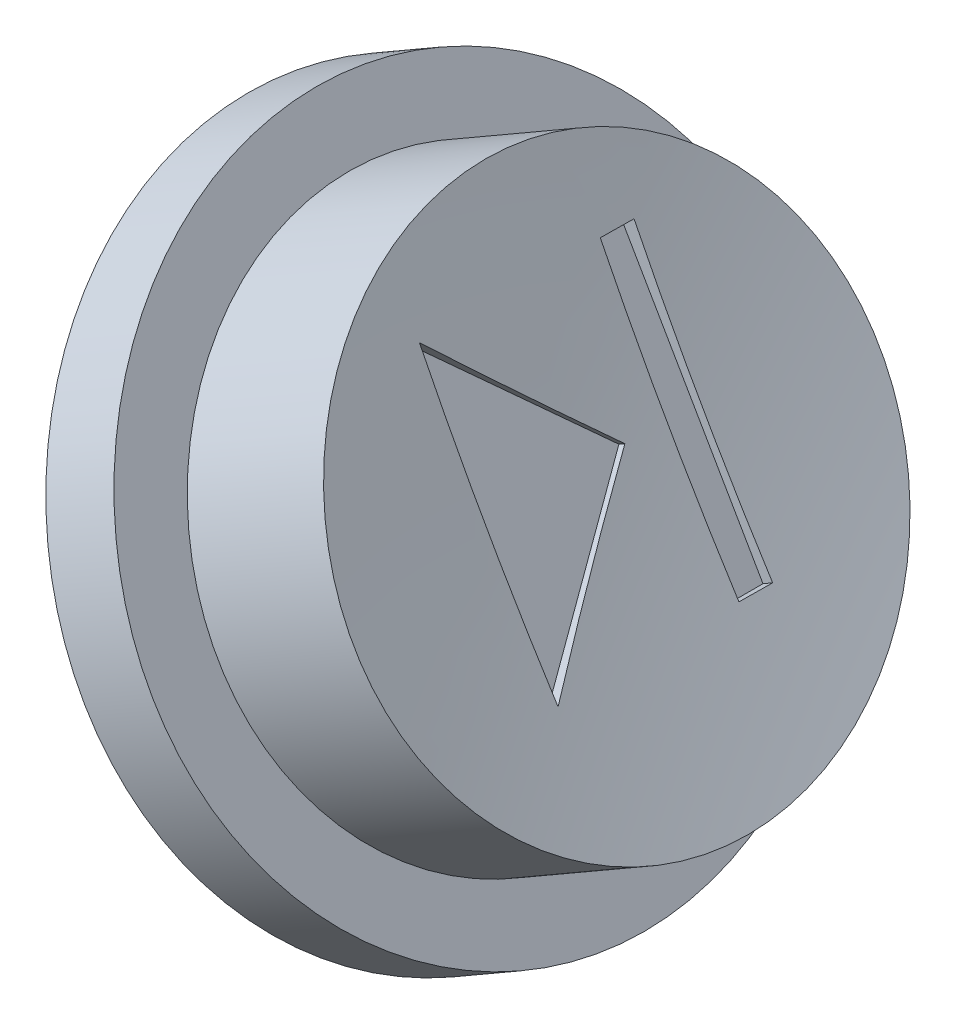
ISO-10303-21;
HEADER;
FILE_DESCRIPTION(('STEP AP214'),'2;1');
FILE_NAME('part.step','',(''),(''),'','','');
FILE_SCHEMA(('AUTOMOTIVE_DESIGN { 1 0 10303 214 1 1 1 1 }'));
ENDSEC;
DATA;
#1=APPLICATION_CONTEXT('core data for automotive mechanical design processes');
#2=APPLICATION_PROTOCOL_DEFINITION('international standard','automotive_design',2000,#1);
#3=PRODUCT_CONTEXT('',#1,'mechanical');
#4=PRODUCT('Part','Part','',(#3));
#5=PRODUCT_RELATED_PRODUCT_CATEGORY('part','',(#4));
#6=PRODUCT_DEFINITION_FORMATION('','',#4);
#7=PRODUCT_DEFINITION_CONTEXT('part definition',#1,'design');
#8=PRODUCT_DEFINITION('design','',#6,#7);
#9=PRODUCT_DEFINITION_SHAPE('','',#8);
#10=(LENGTH_UNIT() NAMED_UNIT(*) SI_UNIT(.MILLI.,.METRE.));
#11=(NAMED_UNIT(*) PLANE_ANGLE_UNIT() SI_UNIT($,.RADIAN.));
#12=(NAMED_UNIT(*) SI_UNIT($,.STERADIAN.) SOLID_ANGLE_UNIT());
#13=UNCERTAINTY_MEASURE_WITH_UNIT(LENGTH_MEASURE(1.E-05),#10,'distance_accuracy_value','');
#14=(GEOMETRIC_REPRESENTATION_CONTEXT(3) GLOBAL_UNCERTAINTY_ASSIGNED_CONTEXT((#13)) GLOBAL_UNIT_ASSIGNED_CONTEXT((#10,
#11,#12)) REPRESENTATION_CONTEXT('',''));
#15=CARTESIAN_POINT('',(0.,0.,0.));
#16=DIRECTION('',(0.,0.,1.));
#17=DIRECTION('',(1.,0.,0.));
#18=AXIS2_PLACEMENT_3D('',#15,#16,#17);
#19=CARTESIAN_POINT('',(48.5272413359522,-65.0516475450257,0.));
#20=DIRECTION('',(-0.866025403784438,-0.500000000000001,0.));
#21=DIRECTION('',(0.500000000000001,-0.866025403784438,0.));
#22=AXIS2_PLACEMENT_3D('',#19,#20,#21);
#23=PLANE('',#22);
#24=CARTESIAN_POINT('',(48.5272413359522,-65.0516475450257,0.));
#25=DIRECTION('',(0.866025403784438,0.500000000000001,0.));
#26=DIRECTION('',(-0.500000000000001,0.866025403784438,0.));
#27=AXIS2_PLACEMENT_3D('',#24,#25,#26);
#28=CIRCLE('',#27,2.);
#29=CARTESIAN_POINT('',(47.5272413359523,-63.3195967374569,0.));
#30=VERTEX_POINT('',#29);
#31=EDGE_CURVE('E158',#30,#30,#28,.T.);
#32=ORIENTED_EDGE('',*,*,#31,.F.);
#33=EDGE_LOOP('',(#32));
#34=FACE_BOUND('',#33,.T.);
#35=ADVANCED_FACE('F36',(#34),#23,.T.);
#36=CARTESIAN_POINT('',(53.7233937586589,-62.0516475450258,0.));
#37=DIRECTION('',(0.866025403784438,0.500000000000001,0.));
#38=DIRECTION('',(-0.500000000000001,0.866025403784438,0.));
#39=AXIS2_PLACEMENT_3D('',#36,#37,#38);
#40=CYLINDRICAL_SURFACE('',#39,2.);
#41=CARTESIAN_POINT('',(52.4243556529822,-62.8016475450258,0.));
#42=DIRECTION('',(0.866025403784438,0.500000000000001,0.));
#43=DIRECTION('',(-0.500000000000001,0.866025403784438,0.));
#44=AXIS2_PLACEMENT_3D('',#41,#42,#43);
#45=CIRCLE('',#44,1.99999999999999);
#46=CARTESIAN_POINT('',(51.4243556529822,-61.0695967374569,0.));
#47=VERTEX_POINT('',#46);
#48=EDGE_CURVE('E155',#47,#47,#45,.T.);
#49=CARTESIAN_POINT('',(47.5272413359523,-63.3195967374569,0.));
#50=CARTESIAN_POINT('',(47.5678362767547,-63.2961592374569,0.));
#51=CARTESIAN_POINT('',(47.608431217557,-63.2727217374569,0.));
#52=CARTESIAN_POINT('',(47.6896210991618,-63.2258467374569,0.));
#53=CARTESIAN_POINT('',(47.7302160399642,-63.2024092374569,0.));
#54=CARTESIAN_POINT('',(47.811405921569,-63.1555342374569,0.));
#55=CARTESIAN_POINT('',(47.8520008623714,-63.1320967374569,0.));
#56=CARTESIAN_POINT('',(47.9331907439762,-63.0852217374569,0.));
#57=CARTESIAN_POINT('',(47.9737856847786,-63.0617842374569,0.));
#58=CARTESIAN_POINT('',(48.0549755663834,-63.0149092374569,0.));
#59=CARTESIAN_POINT('',(48.0955705071858,-62.9914717374569,0.));
#60=CARTESIAN_POINT('',(48.1767603887906,-62.9445967374569,0.));
#61=CARTESIAN_POINT('',(48.217355329593,-62.9211592374569,0.));
#62=CARTESIAN_POINT('',(48.2985452111978,-62.8742842374569,0.));
#63=CARTESIAN_POINT('',(48.3391401520002,-62.8508467374569,0.));
#64=CARTESIAN_POINT('',(48.4203300336049,-62.8039717374569,0.));
#65=CARTESIAN_POINT('',(48.4609249744073,-62.7805342374569,0.));
#66=CARTESIAN_POINT('',(48.5421148560121,-62.7336592374569,0.));
#67=CARTESIAN_POINT('',(48.5827097968145,-62.7102217374569,0.));
#68=CARTESIAN_POINT('',(48.6638996784193,-62.6633467374569,0.));
#69=CARTESIAN_POINT('',(48.7044946192217,-62.6399092374569,0.));
#70=CARTESIAN_POINT('',(48.7856845008265,-62.5930342374569,0.));
#71=CARTESIAN_POINT('',(48.8262794416289,-62.5695967374569,0.));
#72=CARTESIAN_POINT('',(48.9074693232337,-62.5227217374569,0.));
#73=CARTESIAN_POINT('',(48.9480642640361,-62.4992842374569,0.));
#74=CARTESIAN_POINT('',(49.0292541456409,-62.4524092374569,0.));
#75=CARTESIAN_POINT('',(49.0698490864433,-62.4289717374569,0.));
#76=CARTESIAN_POINT('',(49.1510389680481,-62.3820967374569,0.));
#77=CARTESIAN_POINT('',(49.1916339088504,-62.3586592374569,0.));
#78=CARTESIAN_POINT('',(49.2728237904552,-62.3117842374569,0.));
#79=CARTESIAN_POINT('',(49.3134187312576,-62.2883467374569,0.));
#80=CARTESIAN_POINT('',(49.3946086128624,-62.2414717374569,0.));
#81=CARTESIAN_POINT('',(49.4352035536648,-62.2180342374569,0.));
#82=CARTESIAN_POINT('',(49.5163934352696,-62.1711592374569,0.));
#83=CARTESIAN_POINT('',(49.556988376072,-62.1477217374569,0.));
#84=CARTESIAN_POINT('',(49.6381782576768,-62.1008467374569,0.));
#85=CARTESIAN_POINT('',(49.6787731984792,-62.0774092374569,0.));
#86=CARTESIAN_POINT('',(49.759963080084,-62.0305342374569,0.));
#87=CARTESIAN_POINT('',(49.8005580208864,-62.0070967374569,0.));
#88=CARTESIAN_POINT('',(49.8817479024912,-61.9602217374569,0.));
#89=CARTESIAN_POINT('',(49.9223428432936,-61.9367842374569,0.));
#90=CARTESIAN_POINT('',(50.0035327248984,-61.8899092374569,0.));
#91=CARTESIAN_POINT('',(50.0441276657007,-61.8664717374569,0.));
#92=CARTESIAN_POINT('',(50.1253175473055,-61.8195967374569,0.));
#93=CARTESIAN_POINT('',(50.1659124881079,-61.7961592374569,0.));
#94=CARTESIAN_POINT('',(50.2471023697127,-61.7492842374569,0.));
#95=CARTESIAN_POINT('',(50.2876973105151,-61.7258467374569,0.));
#96=CARTESIAN_POINT('',(50.3688871921199,-61.6789717374569,0.));
#97=CARTESIAN_POINT('',(50.4094821329223,-61.6555342374569,0.));
#98=CARTESIAN_POINT('',(50.4906720145271,-61.6086592374569,0.));
#99=CARTESIAN_POINT('',(50.5312669553295,-61.5852217374569,0.));
#100=CARTESIAN_POINT('',(50.6124568369343,-61.5383467374569,0.));
#101=CARTESIAN_POINT('',(50.6530517777367,-61.5149092374569,0.));
#102=CARTESIAN_POINT('',(50.7342416593415,-61.4680342374569,0.));
#103=CARTESIAN_POINT('',(50.7748366001439,-61.4445967374569,0.));
#104=CARTESIAN_POINT('',(50.8560264817487,-61.3977217374569,0.));
#105=CARTESIAN_POINT('',(50.896621422551,-61.3742842374569,0.));
#106=CARTESIAN_POINT('',(50.9778113041558,-61.3274092374569,0.));
#107=CARTESIAN_POINT('',(51.0184062449582,-61.3039717374569,0.));
#108=CARTESIAN_POINT('',(51.099596126563,-61.2570967374569,0.));
#109=CARTESIAN_POINT('',(51.1401910673654,-61.2336592374569,0.));
#110=CARTESIAN_POINT('',(51.2213809489702,-61.1867842374569,0.));
#111=CARTESIAN_POINT('',(51.2619758897726,-61.1633467374569,0.));
#112=CARTESIAN_POINT('',(51.3431657713774,-61.1164717374569,0.));
#113=CARTESIAN_POINT('',(51.3837607121798,-61.0930342374569,0.));
#114=CARTESIAN_POINT('',(51.4243556529822,-61.0695967374569,0.));
#115=B_SPLINE_CURVE_WITH_KNOTS('',3,(#49,#50,#51,#52,#53,#54,#55,#56,#57,#58,#59,#60,#61,#62,
#63,#64,#65,#66,#67,#68,#69,#70,#71,#72,#73,#74,#75,#76,#77,#78,#79,#80,#81,#82,#83,#84,#85,#86,
#87,#88,#89,#90,#91,#92,#93,#94,#95,#96,#97,#98,#99,#100,#101,#102,#103,#104,#105,#106,#107,
#108,#109,#110,#111,#112,#113,#114),.UNSPECIFIED.,.F.,.F.,(4,2,2,2,2,2,2,2,2,2,2,2,2,2,2,2,2,2,
2,2,2,2,2,2,2,2,2,2,2,2,2,2,4),(0.,0.140624999999999,0.281249999999998,0.42187499999999,
0.562499999999988,0.703124999999993,0.843749999999992,0.984374999999984,1.12499999999998,
1.26562499999998,1.40624999999999,1.54687499999999,1.68749999999998,1.82812499999998,
1.96874999999998,2.10937499999998,2.24999999999998,2.39062499999997,2.53124999999997,
2.67187499999997,2.81249999999997,2.95312499999996,3.09374999999996,3.23437499999997,
3.37499999999996,3.51562499999996,3.65624999999996,3.79687499999995,3.93749999999996,
4.07812499999996,4.21874999999995,4.35937499999995,4.49999999999995),.UNSPECIFIED.);
#116=EDGE_CURVE('BSEAM198',#30,#47,#115,.T.);
#117=ORIENTED_EDGE('',*,*,#31,.T.);
#118=ORIENTED_EDGE('',*,*,#48,.F.);
#119=ORIENTED_EDGE('',*,*,#116,.T.);
#120=ORIENTED_EDGE('',*,*,#116,.F.);
#121=EDGE_LOOP('',(#117,#119,#118,#120));
#122=FACE_BOUND('',#121,.T.);
#123=ADVANCED_FACE('F198',(#122),#40,.T.);
#124=CARTESIAN_POINT('',(51.4243556529822,-61.0695967374569,0.));
#125=DIRECTION('',(-0.866025403784438,-0.500000000000001,0.));
#126=DIRECTION('',(0.500000000000001,-0.866025403784438,0.));
#127=AXIS2_PLACEMENT_3D('',#124,#125,#126);
#128=PLANE('',#127);
#129=ORIENTED_EDGE('',*,*,#48,.T.);
#130=EDGE_LOOP('',(#129));
#131=FACE_BOUND('',#130,.T.);
#132=CARTESIAN_POINT('',(52.4243556529822,-62.8016475450258,0.));
#133=DIRECTION('',(0.866025403784438,0.500000000000001,0.));
#134=DIRECTION('',(-0.500000000000001,0.866025403784438,0.));
#135=AXIS2_PLACEMENT_3D('',#132,#133,#134);
#136=CIRCLE('',#135,3.00000000000005);
#137=CARTESIAN_POINT('',(50.9243556529822,-60.2035713336724,0.));
#138=VERTEX_POINT('',#137);
#139=EDGE_CURVE('E152',#138,#138,#136,.T.);
#140=ORIENTED_EDGE('',*,*,#139,.F.);
#141=EDGE_LOOP('',(#140));
#142=FACE_BOUND('',#141,.T.);
#143=ADVANCED_FACE('F203',(#131,#142),#128,.T.);
#144=CARTESIAN_POINT('',(53.7233937586589,-62.0516475450258,0.));
#145=DIRECTION('',(0.866025403784438,0.500000000000001,0.));
#146=DIRECTION('',(-0.500000000000001,0.866025403784438,0.));
#147=AXIS2_PLACEMENT_3D('',#144,#145,#146);
#148=CYLINDRICAL_SURFACE('',#147,3.00000000000006);
#149=CARTESIAN_POINT('',(50.6057023050349,-63.8516475450258,0.));
#150=DIRECTION('',(0.866025403784438,0.500000000000001,0.));
#151=DIRECTION('',(-0.500000000000001,0.866025403784438,0.));
#152=AXIS2_PLACEMENT_3D('',#149,#150,#151);
#153=CIRCLE('',#152,3.00000000000007);
#154=CARTESIAN_POINT('',(49.1057023050349,-61.2535713336724,0.));
#155=VERTEX_POINT('',#154);
#156=EDGE_CURVE('E149',#155,#155,#153,.T.);
#157=CARTESIAN_POINT('',(50.9243556529822,-60.2035713336724,0.));
#158=CARTESIAN_POINT('',(50.9054113472744,-60.2145088336724,0.));
#159=CARTESIAN_POINT('',(50.8864670415666,-60.2254463336724,0.));
#160=CARTESIAN_POINT('',(50.848578430151,-60.2473213336724,0.));
#161=CARTESIAN_POINT('',(50.8296341244432,-60.2582588336724,0.));
#162=CARTESIAN_POINT('',(50.7917455130277,-60.2801338336724,0.));
#163=CARTESIAN_POINT('',(50.7728012073199,-60.2910713336724,0.));
#164=CARTESIAN_POINT('',(50.7349125959043,-60.3129463336724,0.));
#165=CARTESIAN_POINT('',(50.7159682901965,-60.3238838336724,0.));
#166=CARTESIAN_POINT('',(50.678079678781,-60.3457588336724,0.));
#167=CARTESIAN_POINT('',(50.6591353730732,-60.3566963336724,0.));
#168=CARTESIAN_POINT('',(50.6212467616576,-60.3785713336724,0.));
#169=CARTESIAN_POINT('',(50.6023024559498,-60.3895088336724,0.));
#170=CARTESIAN_POINT('',(50.5644138445343,-60.4113838336724,0.));
#171=CARTESIAN_POINT('',(50.5454695388265,-60.4223213336724,0.));
#172=CARTESIAN_POINT('',(50.5075809274109,-60.4441963336724,0.));
#173=CARTESIAN_POINT('',(50.4886366217031,-60.4551338336724,0.));
#174=CARTESIAN_POINT('',(50.4507480102875,-60.4770088336724,0.));
#175=CARTESIAN_POINT('',(50.4318037045798,-60.4879463336724,0.));
#176=CARTESIAN_POINT('',(50.3939150931642,-60.5098213336724,0.));
#177=CARTESIAN_POINT('',(50.3749707874564,-60.5207588336724,0.));
#178=CARTESIAN_POINT('',(50.3370821760408,-60.5426338336724,0.));
#179=CARTESIAN_POINT('',(50.3181378703331,-60.5535713336724,0.));
#180=CARTESIAN_POINT('',(50.2802492589175,-60.5754463336724,0.));
#181=CARTESIAN_POINT('',(50.2613049532097,-60.5863838336724,0.));
#182=CARTESIAN_POINT('',(50.2234163417941,-60.6082588336724,0.));
#183=CARTESIAN_POINT('',(50.2044720360864,-60.6191963336724,0.));
#184=CARTESIAN_POINT('',(50.1665834246708,-60.6410713336724,0.));
#185=CARTESIAN_POINT('',(50.147639118963,-60.6520088336724,0.));
#186=CARTESIAN_POINT('',(50.1097505075474,-60.6738838336724,0.));
#187=CARTESIAN_POINT('',(50.0908062018396,-60.6848213336724,0.));
#188=CARTESIAN_POINT('',(50.0529175904241,-60.7066963336724,0.));
#189=CARTESIAN_POINT('',(50.0339732847163,-60.7176338336724,0.));
#190=CARTESIAN_POINT('',(49.9960846733007,-60.7395088336724,0.));
#191=CARTESIAN_POINT('',(49.9771403675929,-60.7504463336724,0.));
#192=CARTESIAN_POINT('',(49.9392517561774,-60.7723213336724,0.));
#193=CARTESIAN_POINT('',(49.9203074504696,-60.7832588336724,0.));
#194=CARTESIAN_POINT('',(49.882418839054,-60.8051338336724,0.));
#195=CARTESIAN_POINT('',(49.8634745333462,-60.8160713336724,0.));
#196=CARTESIAN_POINT('',(49.8255859219307,-60.8379463336724,0.));
#197=CARTESIAN_POINT('',(49.8066416162229,-60.8488838336724,0.));
#198=CARTESIAN_POINT('',(49.7687530048073,-60.8707588336724,0.));
#199=CARTESIAN_POINT('',(49.7498086990995,-60.8816963336724,0.));
#200=CARTESIAN_POINT('',(49.7119200876839,-60.9035713336724,0.));
#201=CARTESIAN_POINT('',(49.6929757819762,-60.9145088336724,0.));
#202=CARTESIAN_POINT('',(49.6550871705606,-60.9363838336724,0.));
#203=CARTESIAN_POINT('',(49.6361428648528,-60.9473213336724,0.));
#204=CARTESIAN_POINT('',(49.5982542534372,-60.9691963336724,0.));
#205=CARTESIAN_POINT('',(49.5793099477295,-60.9801338336724,0.));
#206=CARTESIAN_POINT('',(49.5414213363139,-61.0020088336724,0.));
#207=CARTESIAN_POINT('',(49.5224770306061,-61.0129463336724,0.));
#208=CARTESIAN_POINT('',(49.4845884191905,-61.0348213336724,0.));
#209=CARTESIAN_POINT('',(49.4656441134828,-61.0457588336724,0.));
#210=CARTESIAN_POINT('',(49.4277555020672,-61.0676338336724,0.));
#211=CARTESIAN_POINT('',(49.4088111963594,-61.0785713336724,0.));
#212=CARTESIAN_POINT('',(49.3709225849438,-61.1004463336724,0.));
#213=CARTESIAN_POINT('',(49.3519782792361,-61.1113838336724,0.));
#214=CARTESIAN_POINT('',(49.3140896678205,-61.1332588336724,0.));
#215=CARTESIAN_POINT('',(49.2951453621127,-61.1441963336724,0.));
#216=CARTESIAN_POINT('',(49.2572567506971,-61.1660713336724,0.));
#217=CARTESIAN_POINT('',(49.2383124449893,-61.1770088336724,0.));
#218=CARTESIAN_POINT('',(49.2004238335738,-61.1988838336724,0.));
#219=CARTESIAN_POINT('',(49.181479527866,-61.2098213336724,0.));
#220=CARTESIAN_POINT('',(49.1435909164504,-61.2316963336724,0.));
#221=CARTESIAN_POINT('',(49.1246466107426,-61.2426338336724,0.));
#222=CARTESIAN_POINT('',(49.1057023050349,-61.2535713336724,0.));
#223=B_SPLINE_CURVE_WITH_KNOTS('',3,(#157,#158,#159,#160,#161,#162,#163,#164,#165,#166,#167,
#168,#169,#170,#171,#172,#173,#174,#175,#176,#177,#178,#179,#180,#181,#182,#183,#184,#185,#186,
#187,#188,#189,#190,#191,#192,#193,#194,#195,#196,#197,#198,#199,#200,#201,#202,#203,#204,#205,
#206,#207,#208,#209,#210,#211,#212,#213,#214,#215,#216,#217,#218,#219,#220,#221,#222),
.UNSPECIFIED.,.F.,.F.,(4,2,2,2,2,2,2,2,2,2,2,2,2,2,2,2,2,2,2,2,2,2,2,2,2,2,2,2,2,2,2,2,4),(0.,
0.065624999999996,0.131250000000001,0.196875,0.262499999999999,0.328125000000001,
0.393749999999997,0.459374999999999,0.525000000000001,0.590624999999997,0.656249999999999,
0.721874999999995,0.787499999999997,0.853124999999999,0.918749999999995,0.984374999999997,1.05,
1.11562499999999,1.18125,1.24687499999999,1.31249999999999,1.378125,1.44374999999999,
1.50937499999999,1.57499999999999,1.64062499999999,1.70624999999999,1.77187499999999,
1.83749999999999,1.90312499999999,1.96874999999999,2.03437499999999,2.09999999999999),.UNSPECIFIED.);
#224=EDGE_CURVE('BSEAM210',#138,#155,#223,.T.);
#225=ORIENTED_EDGE('',*,*,#139,.T.);
#226=ORIENTED_EDGE('',*,*,#156,.F.);
#227=ORIENTED_EDGE('',*,*,#224,.T.);
#228=ORIENTED_EDGE('',*,*,#224,.F.);
#229=EDGE_LOOP('',(#225,#227,#226,#228));
#230=FACE_BOUND('',#229,.T.);
#231=ADVANCED_FACE('F210',(#230),#148,.F.);
#232=CARTESIAN_POINT('',(49.1057023050348,-61.2535713336724,0.));
#233=DIRECTION('',(-0.866025403784438,-0.500000000000001,0.));
#234=DIRECTION('',(0.500000000000001,-0.866025403784438,0.));
#235=AXIS2_PLACEMENT_3D('',#232,#233,#234);
#236=PLANE('',#235);
#237=ORIENTED_EDGE('',*,*,#156,.T.);
#238=EDGE_LOOP('',(#237));
#239=FACE_BOUND('',#238,.T.);
#240=CARTESIAN_POINT('',(50.6057023050349,-63.8516475450258,0.));
#241=DIRECTION('',(0.866025403784438,0.500000000000001,0.));
#242=DIRECTION('',(-0.500000000000001,0.866025403784438,0.));
#243=AXIS2_PLACEMENT_3D('',#240,#241,#242);
#244=CIRCLE('',#243,5.00000000000007);
#245=CARTESIAN_POINT('',(48.1057023050348,-59.5215205261035,0.));
#246=VERTEX_POINT('',#245);
#247=EDGE_CURVE('E146',#246,#246,#244,.T.);
#248=ORIENTED_EDGE('',*,*,#247,.F.);
#249=EDGE_LOOP('',(#248));
#250=FACE_BOUND('',#249,.T.);
#251=ADVANCED_FACE('F214',(#239,#250),#236,.T.);
#252=CARTESIAN_POINT('',(53.7233937586589,-62.0516475450258,0.));
#253=DIRECTION('',(0.866025403784438,0.500000000000001,0.));
#254=DIRECTION('',(-0.500000000000001,0.866025403784438,0.));
#255=AXIS2_PLACEMENT_3D('',#252,#253,#254);
#256=CYLINDRICAL_SURFACE('',#255,5.00000000000007);
#257=CARTESIAN_POINT('',(51.6449327895762,-63.2516475450258,0.));
#258=DIRECTION('',(0.866025403784438,0.500000000000001,0.));
#259=DIRECTION('',(-0.500000000000001,0.866025403784438,0.));
#260=AXIS2_PLACEMENT_3D('',#257,#258,#259);
#261=CIRCLE('',#260,5.00000000000007);
#262=CARTESIAN_POINT('',(49.1449327895762,-58.9215205261035,0.));
#263=VERTEX_POINT('',#262);
#264=EDGE_CURVE('E143',#263,#263,#261,.T.);
#265=CARTESIAN_POINT('',(48.1057023050348,-59.5215205261035,0.));
#266=CARTESIAN_POINT('',(48.1165276225821,-59.5152705261035,0.));
#267=CARTESIAN_POINT('',(48.1273529401294,-59.5090205261035,0.));
#268=CARTESIAN_POINT('',(48.1490035752241,-59.4965205261035,0.));
#269=CARTESIAN_POINT('',(48.1598288927714,-59.4902705261035,0.));
#270=CARTESIAN_POINT('',(48.181479527866,-59.4777705261035,0.));
#271=CARTESIAN_POINT('',(48.1923048454133,-59.4715205261035,0.));
#272=CARTESIAN_POINT('',(48.2139554805079,-59.4590205261035,0.));
#273=CARTESIAN_POINT('',(48.2247807980552,-59.4527705261035,0.));
#274=CARTESIAN_POINT('',(48.2464314331498,-59.4402705261035,0.));
#275=CARTESIAN_POINT('',(48.2572567506971,-59.4340205261035,0.));
#276=CARTESIAN_POINT('',(48.2789073857917,-59.4215205261035,0.));
#277=CARTESIAN_POINT('',(48.289732703339,-59.4152705261035,0.));
#278=CARTESIAN_POINT('',(48.3113833384337,-59.4027705261035,0.));
#279=CARTESIAN_POINT('',(48.322208655981,-59.3965205261035,0.));
#280=CARTESIAN_POINT('',(48.3438592910756,-59.3840205261035,0.));
#281=CARTESIAN_POINT('',(48.3546846086229,-59.3777705261035,0.));
#282=CARTESIAN_POINT('',(48.3763352437175,-59.3652705261035,0.));
#283=CARTESIAN_POINT('',(48.3871605612648,-59.3590205261035,0.));
#284=CARTESIAN_POINT('',(48.4088111963594,-59.3465205261035,0.));
#285=CARTESIAN_POINT('',(48.4196365139067,-59.3402705261035,0.));
#286=CARTESIAN_POINT('',(48.4412871490013,-59.3277705261035,0.));
#287=CARTESIAN_POINT('',(48.4521124665486,-59.3215205261035,0.));
#288=CARTESIAN_POINT('',(48.4737631016432,-59.3090205261035,0.));
#289=CARTESIAN_POINT('',(48.4845884191905,-59.3027705261035,0.));
#290=CARTESIAN_POINT('',(48.5062390542851,-59.2902705261035,0.));
#291=CARTESIAN_POINT('',(48.5170643718324,-59.2840205261035,0.));
#292=CARTESIAN_POINT('',(48.5387150069271,-59.2715205261035,0.));
#293=CARTESIAN_POINT('',(48.5495403244744,-59.2652705261035,0.));
#294=CARTESIAN_POINT('',(48.571190959569,-59.2527705261035,0.));
#295=CARTESIAN_POINT('',(48.5820162771163,-59.2465205261035,0.));
#296=CARTESIAN_POINT('',(48.6036669122109,-59.2340205261035,0.));
#297=CARTESIAN_POINT('',(48.6144922297582,-59.2277705261035,0.));
#298=CARTESIAN_POINT('',(48.6361428648528,-59.2152705261035,0.));
#299=CARTESIAN_POINT('',(48.6469681824001,-59.2090205261035,0.));
#300=CARTESIAN_POINT('',(48.6686188174947,-59.1965205261035,0.));
#301=CARTESIAN_POINT('',(48.679444135042,-59.1902705261035,0.));
#302=CARTESIAN_POINT('',(48.7010947701366,-59.1777705261035,0.));
#303=CARTESIAN_POINT('',(48.7119200876839,-59.1715205261035,0.));
#304=CARTESIAN_POINT('',(48.7335707227786,-59.1590205261035,0.));
#305=CARTESIAN_POINT('',(48.7443960403259,-59.1527705261035,0.));
#306=CARTESIAN_POINT('',(48.7660466754205,-59.1402705261035,0.));
#307=CARTESIAN_POINT('',(48.7768719929678,-59.1340205261035,0.));
#308=CARTESIAN_POINT('',(48.7985226280624,-59.1215205261035,0.));
#309=CARTESIAN_POINT('',(48.8093479456097,-59.1152705261035,0.));
#310=CARTESIAN_POINT('',(48.8309985807043,-59.1027705261035,0.));
#311=CARTESIAN_POINT('',(48.8418238982516,-59.0965205261035,0.));
#312=CARTESIAN_POINT('',(48.8634745333462,-59.0840205261035,0.));
#313=CARTESIAN_POINT('',(48.8742998508935,-59.0777705261035,0.));
#314=CARTESIAN_POINT('',(48.8959504859881,-59.0652705261035,0.));
#315=CARTESIAN_POINT('',(48.9067758035354,-59.0590205261035,0.));
#316=CARTESIAN_POINT('',(48.9284264386301,-59.0465205261035,0.));
#317=CARTESIAN_POINT('',(48.9392517561774,-59.0402705261035,0.));
#318=CARTESIAN_POINT('',(48.960902391272,-59.0277705261035,0.));
#319=CARTESIAN_POINT('',(48.9717277088193,-59.0215205261035,0.));
#320=CARTESIAN_POINT('',(48.9933783439139,-59.0090205261035,0.));
#321=CARTESIAN_POINT('',(49.0042036614612,-59.0027705261035,0.));
#322=CARTESIAN_POINT('',(49.0258542965558,-58.9902705261035,0.));
#323=CARTESIAN_POINT('',(49.0366796141031,-58.9840205261035,0.));
#324=CARTESIAN_POINT('',(49.0583302491977,-58.9715205261035,0.));
#325=CARTESIAN_POINT('',(49.069155566745,-58.9652705261035,0.));
#326=CARTESIAN_POINT('',(49.0908062018396,-58.9527705261035,0.));
#327=CARTESIAN_POINT('',(49.1016315193869,-58.9465205261035,0.));
#328=CARTESIAN_POINT('',(49.1232821544816,-58.9340205261035,0.));
#329=CARTESIAN_POINT('',(49.1341074720289,-58.9277705261035,0.));
#330=CARTESIAN_POINT('',(49.1449327895762,-58.9215205261035,0.));
#331=B_SPLINE_CURVE_WITH_KNOTS('',3,(#265,#266,#267,#268,#269,#270,#271,#272,#273,#274,#275,
#276,#277,#278,#279,#280,#281,#282,#283,#284,#285,#286,#287,#288,#289,#290,#291,#292,#293,#294,
#295,#296,#297,#298,#299,#300,#301,#302,#303,#304,#305,#306,#307,#308,#309,#310,#311,#312,#313,
#314,#315,#316,#317,#318,#319,#320,#321,#322,#323,#324,#325,#326,#327,#328,#329,#330),
.UNSPECIFIED.,.F.,.F.,(4,2,2,2,2,2,2,2,2,2,2,2,2,2,2,2,2,2,2,2,2,2,2,2,2,2,2,2,2,2,2,2,4),(0.,
0.0375000000000062,0.0750000000000029,0.1125,0.150000000000002,0.187500000000002,
0.225000000000005,0.262500000000002,0.300000000000002,0.337500000000005,0.375000000000001,
0.412499999999998,0.450000000000004,0.487500000000001,0.524999999999998,0.562500000000004,
0.600000000000001,0.637499999999997,0.675,0.7125,0.749999999999997,0.7875,0.825,
0.862499999999996,0.899999999999999,0.937499999999996,0.974999999999996,1.0125,1.05,1.0875,
1.125,1.1625,1.2),.UNSPECIFIED.);
#332=EDGE_CURVE('BSEAM193',#246,#263,#331,.T.);
#333=ORIENTED_EDGE('',*,*,#247,.T.);
#334=ORIENTED_EDGE('',*,*,#264,.F.);
#335=ORIENTED_EDGE('',*,*,#332,.T.);
#336=ORIENTED_EDGE('',*,*,#332,.F.);
#337=EDGE_LOOP('',(#333,#335,#334,#336));
#338=FACE_BOUND('',#337,.T.);
#339=ADVANCED_FACE('F193',(#338),#256,.T.);
#340=CARTESIAN_POINT('',(49.1449327895762,-58.9215205261035,0.));
#341=DIRECTION('',(0.866025403784438,0.500000000000001,0.));
#342=DIRECTION('',(-0.500000000000001,0.866025403784438,0.));
#343=AXIS2_PLACEMENT_3D('',#340,#341,#342);
#344=PLANE('',#343);
#345=ORIENTED_EDGE('',*,*,#264,.T.);
#346=EDGE_LOOP('',(#345));
#347=FACE_BOUND('',#346,.T.);
#348=CARTESIAN_POINT('',(51.6449327895762,-63.2516475450258,0.));
#349=DIRECTION('',(0.866025403784438,0.500000000000001,0.));
#350=DIRECTION('',(-0.500000000000001,0.866025403784438,0.));
#351=AXIS2_PLACEMENT_3D('',#348,#349,#350);
#352=CIRCLE('',#351,4.00000000000006);
#353=CARTESIAN_POINT('',(49.6449327895762,-59.787545929888,0.));
#354=VERTEX_POINT('',#353);
#355=EDGE_CURVE('E140',#354,#354,#352,.T.);
#356=ORIENTED_EDGE('',*,*,#355,.F.);
#357=EDGE_LOOP('',(#356));
#358=FACE_BOUND('',#357,.T.);
#359=ADVANCED_FACE('F187',(#347,#358),#344,.T.);
#360=CARTESIAN_POINT('',(53.7233937586589,-62.0516475450258,0.));
#361=DIRECTION('',(0.866025403784438,0.500000000000001,0.));
#362=DIRECTION('',(-0.500000000000001,0.866025403784438,0.));
#363=AXIS2_PLACEMENT_3D('',#360,#361,#362);
#364=CYLINDRICAL_SURFACE('',#363,4.00000000000004);
#365=CARTESIAN_POINT('',(53.7233937586589,-62.0516475450258,0.));
#366=DIRECTION('',(0.866025403784438,0.500000000000001,0.));
#367=DIRECTION('',(-0.500000000000001,0.866025403784438,0.));
#368=AXIS2_PLACEMENT_3D('',#365,#366,#367);
#369=CIRCLE('',#368,4.00000000000002);
#370=CARTESIAN_POINT('',(51.7233937586588,-58.587545929888,0.));
#371=VERTEX_POINT('',#370);
#372=EDGE_CURVE('E120',#371,#371,#369,.T.);
#373=CARTESIAN_POINT('',(49.6449327895762,-59.787545929888,0.));
#374=CARTESIAN_POINT('',(49.6665834246708,-59.775045929888,0.));
#375=CARTESIAN_POINT('',(49.6882340597654,-59.762545929888,0.));
#376=CARTESIAN_POINT('',(49.7315353299546,-59.737545929888,0.));
#377=CARTESIAN_POINT('',(49.7531859650492,-59.725045929888,0.));
#378=CARTESIAN_POINT('',(49.7964872352385,-59.700045929888,0.));
#379=CARTESIAN_POINT('',(49.8181378703331,-59.687545929888,0.));
#380=CARTESIAN_POINT('',(49.8614391405223,-59.662545929888,0.));
#381=CARTESIAN_POINT('',(49.8830897756169,-59.650045929888,0.));
#382=CARTESIAN_POINT('',(49.9263910458061,-59.625045929888,0.));
#383=CARTESIAN_POINT('',(49.9480416809007,-59.612545929888,0.));
#384=CARTESIAN_POINT('',(49.99134295109,-59.587545929888,0.));
#385=CARTESIAN_POINT('',(50.0129935861846,-59.575045929888,0.));
#386=CARTESIAN_POINT('',(50.0562948563738,-59.550045929888,0.));
#387=CARTESIAN_POINT('',(50.0779454914684,-59.537545929888,0.));
#388=CARTESIAN_POINT('',(50.1212467616576,-59.512545929888,0.));
#389=CARTESIAN_POINT('',(50.1428973967522,-59.500045929888,0.));
#390=CARTESIAN_POINT('',(50.1861986669415,-59.475045929888,0.));
#391=CARTESIAN_POINT('',(50.2078493020361,-59.462545929888,0.));
#392=CARTESIAN_POINT('',(50.2511505722253,-59.437545929888,0.));
#393=CARTESIAN_POINT('',(50.2728012073199,-59.425045929888,0.));
#394=CARTESIAN_POINT('',(50.3161024775091,-59.400045929888,0.));
#395=CARTESIAN_POINT('',(50.3377531126037,-59.387545929888,0.));
#396=CARTESIAN_POINT('',(50.381054382793,-59.362545929888,0.));
#397=CARTESIAN_POINT('',(50.4027050178876,-59.350045929888,0.));
#398=CARTESIAN_POINT('',(50.4460062880768,-59.325045929888,0.));
#399=CARTESIAN_POINT('',(50.4676569231714,-59.312545929888,0.));
#400=CARTESIAN_POINT('',(50.5109581933606,-59.287545929888,0.));
#401=CARTESIAN_POINT('',(50.5326088284552,-59.275045929888,0.));
#402=CARTESIAN_POINT('',(50.5759100986445,-59.250045929888,0.));
#403=CARTESIAN_POINT('',(50.5975607337391,-59.237545929888,0.));
#404=CARTESIAN_POINT('',(50.6408620039283,-59.212545929888,0.));
#405=CARTESIAN_POINT('',(50.6625126390229,-59.200045929888,0.));
#406=CARTESIAN_POINT('',(50.7058139092121,-59.175045929888,0.));
#407=CARTESIAN_POINT('',(50.7274645443067,-59.162545929888,0.));
#408=CARTESIAN_POINT('',(50.770765814496,-59.137545929888,0.));
#409=CARTESIAN_POINT('',(50.7924164495906,-59.125045929888,0.));
#410=CARTESIAN_POINT('',(50.8357177197798,-59.100045929888,0.));
#411=CARTESIAN_POINT('',(50.8573683548744,-59.087545929888,0.));
#412=CARTESIAN_POINT('',(50.9006696250636,-59.062545929888,0.));
#413=CARTESIAN_POINT('',(50.9223202601582,-59.050045929888,0.));
#414=CARTESIAN_POINT('',(50.9656215303474,-59.025045929888,0.));
#415=CARTESIAN_POINT('',(50.9872721654421,-59.012545929888,0.));
#416=CARTESIAN_POINT('',(51.0305734356313,-58.987545929888,0.));
#417=CARTESIAN_POINT('',(51.0522240707259,-58.975045929888,0.));
#418=CARTESIAN_POINT('',(51.0955253409151,-58.950045929888,0.));
#419=CARTESIAN_POINT('',(51.1171759760097,-58.937545929888,0.));
#420=CARTESIAN_POINT('',(51.1604772461989,-58.912545929888,0.));
#421=CARTESIAN_POINT('',(51.1821278812936,-58.900045929888,0.));
#422=CARTESIAN_POINT('',(51.2254291514828,-58.875045929888,0.));
#423=CARTESIAN_POINT('',(51.2470797865774,-58.862545929888,0.));
#424=CARTESIAN_POINT('',(51.2903810567666,-58.837545929888,0.));
#425=CARTESIAN_POINT('',(51.3120316918612,-58.825045929888,0.));
#426=CARTESIAN_POINT('',(51.3553329620504,-58.800045929888,0.));
#427=CARTESIAN_POINT('',(51.3769835971451,-58.787545929888,0.));
#428=CARTESIAN_POINT('',(51.4202848673343,-58.762545929888,0.));
#429=CARTESIAN_POINT('',(51.4419355024289,-58.750045929888,0.));
#430=CARTESIAN_POINT('',(51.4852367726181,-58.725045929888,0.));
#431=CARTESIAN_POINT('',(51.5068874077127,-58.712545929888,0.));
#432=CARTESIAN_POINT('',(51.550188677902,-58.687545929888,0.));
#433=CARTESIAN_POINT('',(51.5718393129966,-58.675045929888,0.));
#434=CARTESIAN_POINT('',(51.6151405831858,-58.650045929888,0.));
#435=CARTESIAN_POINT('',(51.6367912182804,-58.637545929888,0.));
#436=CARTESIAN_POINT('',(51.6800924884696,-58.612545929888,0.));
#437=CARTESIAN_POINT('',(51.7017431235642,-58.600045929888,0.));
#438=CARTESIAN_POINT('',(51.7233937586588,-58.587545929888,0.));
#439=B_SPLINE_CURVE_WITH_KNOTS('',3,(#373,#374,#375,#376,#377,#378,#379,#380,#381,#382,#383,
#384,#385,#386,#387,#388,#389,#390,#391,#392,#393,#394,#395,#396,#397,#398,#399,#400,#401,#402,
#403,#404,#405,#406,#407,#408,#409,#410,#411,#412,#413,#414,#415,#416,#417,#418,#419,#420,#421,
#422,#423,#424,#425,#426,#427,#428,#429,#430,#431,#432,#433,#434,#435,#436,#437,#438),
.UNSPECIFIED.,.F.,.F.,(4,2,2,2,2,2,2,2,2,2,2,2,2,2,2,2,2,2,2,2,2,2,2,2,2,2,2,2,2,2,2,2,4),(0.,
0.0750000000000029,0.150000000000002,0.225000000000005,0.299999999999999,0.375000000000001,
0.450000000000004,0.525000000000004,0.600000000000001,0.675,0.750000000000003,0.825000000000006,
0.899999999999999,0.975000000000002,1.05,1.125,1.2,1.275,1.35,1.425,1.5,1.575,1.65,1.725,1.8,
1.875,1.95,2.025,2.1,2.175,2.25,2.32500000000001,2.4),.UNSPECIFIED.);
#440=EDGE_CURVE('BSEAM179',#354,#371,#439,.T.);
#441=ORIENTED_EDGE('',*,*,#355,.T.);
#442=ORIENTED_EDGE('',*,*,#372,.F.);
#443=ORIENTED_EDGE('',*,*,#440,.T.);
#444=ORIENTED_EDGE('',*,*,#440,.F.);
#445=EDGE_LOOP('',(#441,#443,#442,#444));
#446=FACE_BOUND('',#445,.T.);
#447=ADVANCED_FACE('F179',(#446),#364,.T.);
#448=CARTESIAN_POINT('',(88.2778073696583,-42.1016475450244,0.));
#449=DIRECTION('',(0.,0.,1.));
#450=DIRECTION('',(1.,0.,0.));
#451=AXIS2_PLACEMENT_3D('',#448,#449,#450);
#452=SPHERICAL_SURFACE('',#451,40.100000000001);
#453=CARTESIAN_POINT('',(88.2778073696583,-42.1016475450244,1.65298423329253));
#454=DIRECTION('',(0.,0.,1.));
#455=DIRECTION('',(1.,0.,0.));
#456=AXIS2_PLACEMENT_3D('',#453,#454,#455);
#457=CIRCLE('',#456,40.0659162271945);
#458=CARTESIAN_POINT('',(52.366609382901,-59.8685691208203,1.65298423329253));
#459=VERTEX_POINT('',#458);
#460=CARTESIAN_POINT('',(54.4808160142431,-63.6200354597023,1.65298423329253));
#461=VERTEX_POINT('',#460);
#462=EDGE_CURVE('E11',#459,#461,#457,.T.);
#463=ORIENTED_EDGE('',*,*,#462,.F.);
#464=CARTESIAN_POINT('',(88.0488050375581,-41.705003870775,-0.458004664200535));
#465=DIRECTION('',(-0.353553390593274,0.612372435695795,-0.707106781186547));
#466=DIRECTION('',(0.,0.755928946018454,0.654653670707977));
#467=AXIS2_PLACEMENT_3D('',#464,#465,#466);
#468=CIRCLE('',#467,40.0947685297623);
#469=CARTESIAN_POINT('',(53.3467526928354,-61.7887351702901,-0.499999999999998));
#470=VERTEX_POINT('',#469);
#471=EDGE_CURVE('E44',#470,#459,#468,.T.);
#472=ORIENTED_EDGE('',*,*,#471,.F.);
#473=CARTESIAN_POINT('',(88.2988050375581,-42.1380165726672,-0.041995335799465));
#474=DIRECTION('',(0.353553390593273,-0.612372435695794,-0.707106781186548));
#475=DIRECTION('',(0.,0.755928946018455,-0.654653670707977));
#476=AXIS2_PLACEMENT_3D('',#473,#474,#475);
#477=CIRCLE('',#476,40.0999560197218);
#478=EDGE_CURVE('E171',#461,#470,#477,.T.);
#479=ORIENTED_EDGE('',*,*,#478,.F.);
#480=EDGE_LOOP('',(#463,#472,#479));
#481=FACE_BOUND('',#480,.T.);
#482=CARTESIAN_POINT('',(88.2778073696583,-42.1016475450244,-1.12102010876651));
#483=DIRECTION('',(0.,0.,1.));
#484=DIRECTION('',(0.,-1.,0.));
#485=AXIS2_PLACEMENT_3D('',#482,#483,#484);
#486=CIRCLE('',#485,40.0843275347837);
#487=CARTESIAN_POINT('',(52.3506318601559,-59.8777937478781,-1.12102010876651));
#488=VERTEX_POINT('',#487);
#489=CARTESIAN_POINT('',(54.4648563560932,-63.6292497726313,-1.12102010876651));
#490=VERTEX_POINT('',#489);
#491=EDGE_CURVE('E169',#488,#490,#486,.T.);
#492=ORIENTED_EDGE('',*,*,#491,.F.);
#493=CARTESIAN_POINT('',(86.9933105888115,-39.8768338584391,0.));
#494=DIRECTION('',(-0.5,0.866025403784439,0.));
#495=DIRECTION('',(-0.866025403784439,-0.5,0.));
#496=AXIS2_PLACEMENT_3D('',#493,#494,#495);
#497=CIRCLE('',#496,40.0176245182052);
#498=CARTESIAN_POINT('',(52.3654760562383,-59.8692234472741,-1.62102010876651));
#499=VERTEX_POINT('',#498);
#500=EDGE_CURVE('E167',#499,#488,#497,.T.);
#501=ORIENTED_EDGE('',*,*,#500,.F.);
#502=CARTESIAN_POINT('',(88.2778073696583,-42.1016475450244,-1.62102010876651));
#503=DIRECTION('',(0.,0.,-1.));
#504=DIRECTION('',(0.,1.,0.));
#505=AXIS2_PLACEMENT_3D('',#502,#503,#504);
#506=CIRCLE('',#505,40.0672221873073);
#507=CARTESIAN_POINT('',(54.4796839553042,-63.6206890542354,-1.62102010876651));
#508=VERTEX_POINT('',#507);
#509=EDGE_CURVE('E165',#508,#499,#506,.T.);
#510=ORIENTED_EDGE('',*,*,#509,.F.);
#511=CARTESIAN_POINT('',(89.1462948221041,-43.6059119383965,0.));
#512=DIRECTION('',(0.5,-0.866025403784439,0.));
#513=DIRECTION('',(0.866025403784439,0.5,0.));
#514=AXIS2_PLACEMENT_3D('',#511,#512,#513);
#515=CIRCLE('',#514,40.0623628631644);
#516=EDGE_CURVE('E161',#490,#508,#515,.T.);
#517=ORIENTED_EDGE('',*,*,#516,.F.);
#518=EDGE_LOOP('',(#492,#501,#510,#517));
#519=FACE_BOUND('',#518,.T.);
#520=ORIENTED_EDGE('',*,*,#372,.T.);
#521=EDGE_LOOP('',(#520));
#522=FACE_BOUND('',#521,.T.);
#523=ADVANCED_FACE('F38',(#481,#519,#522),#452,.F.);
#524=CARTESIAN_POINT('',(52.1790893566762,-59.9768338584396,-1.12102010876651));
#525=DIRECTION('',(0.,0.,1.));
#526=DIRECTION('',(0.,-1.,0.));
#527=AXIS2_PLACEMENT_3D('',#524,#525,#526);
#528=PLANE('',#527);
#529=ORIENTED_EDGE('',*,*,#491,.T.);
#530=DIRECTION('',(0.866025403784439,0.5,0.));
#531=VECTOR('',#530,1.);
#532=CARTESIAN_POINT('',(54.3320735899687,-63.705911938397,-1.12102010876651));
#533=LINE('',#532,#531);
#534=CARTESIAN_POINT('',(54.3320735899687,-63.705911938397,-1.12102010876651));
#535=VERTEX_POINT('',#534);
#536=EDGE_CURVE('E58',#535,#490,#533,.T.);
#537=ORIENTED_EDGE('',*,*,#536,.F.);
#538=DIRECTION('',(0.5,-0.866025403784439,0.));
#539=VECTOR('',#538,1.);
#540=CARTESIAN_POINT('',(52.1790893566762,-59.9768338584396,-1.12102010876651));
#541=LINE('',#540,#539);
#542=CARTESIAN_POINT('',(52.1790893566762,-59.9768338584396,-1.12102010876651));
#543=VERTEX_POINT('',#542);
#544=EDGE_CURVE('E122',#543,#535,#541,.T.);
#545=ORIENTED_EDGE('',*,*,#544,.F.);
#546=DIRECTION('',(0.866025403784439,0.5,0.));
#547=VECTOR('',#546,1.);
#548=CARTESIAN_POINT('',(52.1790893566762,-59.9768338584396,-1.12102010876651));
#549=LINE('',#548,#547);
#550=EDGE_CURVE('E111',#543,#488,#549,.T.);
#551=ORIENTED_EDGE('',*,*,#550,.T.);
#552=EDGE_LOOP('',(#529,#537,#545,#551));
#553=FACE_BOUND('',#552,.T.);
#554=ADVANCED_FACE('F178',(#553),#528,.F.);
#555=CARTESIAN_POINT('',(52.1790893566762,-59.9768338584396,-1.12102010876651));
#556=DIRECTION('',(-0.5,0.866025403784439,0.));
#557=DIRECTION('',(-0.866025403784439,-0.5,0.));
#558=AXIS2_PLACEMENT_3D('',#555,#556,#557);
#559=PLANE('',#558);
#560=ORIENTED_EDGE('',*,*,#500,.T.);
#561=ORIENTED_EDGE('',*,*,#550,.F.);
#562=DIRECTION('',(0.,0.,1.));
#563=VECTOR('',#562,1.);
#564=CARTESIAN_POINT('',(52.1790893566762,-59.9768338584396,-1.12102010876651));
#565=LINE('',#564,#563);
#566=CARTESIAN_POINT('',(52.1790893566762,-59.9768338584396,-1.62102010876651));
#567=VERTEX_POINT('',#566);
#568=EDGE_CURVE('E131',#567,#543,#565,.T.);
#569=ORIENTED_EDGE('',*,*,#568,.F.);
#570=DIRECTION('',(0.866025403784439,0.5,0.));
#571=VECTOR('',#570,1.);
#572=CARTESIAN_POINT('',(52.1790893566762,-59.9768338584396,-1.62102010876651));
#573=LINE('',#572,#571);
#574=EDGE_CURVE('E114',#567,#499,#573,.T.);
#575=ORIENTED_EDGE('',*,*,#574,.T.);
#576=EDGE_LOOP('',(#560,#561,#569,#575));
#577=FACE_BOUND('',#576,.T.);
#578=ADVANCED_FACE('F257',(#577),#559,.F.);
#579=CARTESIAN_POINT('',(52.1790893566762,-59.9768338584396,-1.62102010876651));
#580=DIRECTION('',(0.,0.,-1.));
#581=DIRECTION('',(0.,1.,0.));
#582=AXIS2_PLACEMENT_3D('',#579,#580,#581);
#583=PLANE('',#582);
#584=ORIENTED_EDGE('',*,*,#509,.T.);
#585=ORIENTED_EDGE('',*,*,#574,.F.);
#586=DIRECTION('',(-0.5,0.866025403784439,0.));
#587=VECTOR('',#586,1.);
#588=CARTESIAN_POINT('',(52.1790893566762,-59.9768338584396,-1.62102010876651));
#589=LINE('',#588,#587);
#590=CARTESIAN_POINT('',(54.3320735899687,-63.705911938397,-1.62102010876651));
#591=VERTEX_POINT('',#590);
#592=EDGE_CURVE('E128',#591,#567,#589,.T.);
#593=ORIENTED_EDGE('',*,*,#592,.F.);
#594=DIRECTION('',(0.866025403784439,0.5,0.));
#595=VECTOR('',#594,1.);
#596=CARTESIAN_POINT('',(54.3320735899687,-63.705911938397,-1.62102010876651));
#597=LINE('',#596,#595);
#598=EDGE_CURVE('E136',#591,#508,#597,.T.);
#599=ORIENTED_EDGE('',*,*,#598,.T.);
#600=EDGE_LOOP('',(#584,#585,#593,#599));
#601=FACE_BOUND('',#600,.T.);
#602=ADVANCED_FACE('F266',(#601),#583,.F.);
#603=CARTESIAN_POINT('',(54.3320735899687,-63.705911938397,-1.12102010876651));
#604=DIRECTION('',(0.5,-0.866025403784439,0.));
#605=DIRECTION('',(0.866025403784439,0.5,0.));
#606=AXIS2_PLACEMENT_3D('',#603,#604,#605);
#607=PLANE('',#606);
#608=ORIENTED_EDGE('',*,*,#516,.T.);
#609=ORIENTED_EDGE('',*,*,#598,.F.);
#610=DIRECTION('',(0.,0.,-1.));
#611=VECTOR('',#610,1.);
#612=CARTESIAN_POINT('',(54.3320735899687,-63.705911938397,-1.12102010876651));
#613=LINE('',#612,#611);
#614=EDGE_CURVE('E125',#535,#591,#613,.T.);
#615=ORIENTED_EDGE('',*,*,#614,.F.);
#616=ORIENTED_EDGE('',*,*,#536,.T.);
#617=EDGE_LOOP('',(#608,#609,#615,#616));
#618=FACE_BOUND('',#617,.T.);
#619=ADVANCED_FACE('F276',(#618),#607,.F.);
#620=CARTESIAN_POINT('',(13.1635861375235,7.59999999999999,0.));
#621=DIRECTION('',(0.866025403784439,0.5,0.));
#622=DIRECTION('',(-0.5,0.866025403784439,0.));
#623=AXIS2_PLACEMENT_3D('',#620,#621,#622);
#624=PLANE('',#623);
#625=ORIENTED_EDGE('',*,*,#544,.T.);
#626=ORIENTED_EDGE('',*,*,#614,.T.);
#627=ORIENTED_EDGE('',*,*,#592,.T.);
#628=ORIENTED_EDGE('',*,*,#568,.T.);
#629=EDGE_LOOP('',(#625,#626,#627,#628));
#630=FACE_BOUND('',#629,.T.);
#631=ADVANCED_FACE('F286',(#630),#624,.T.);
#632=CARTESIAN_POINT('',(54.3320735899687,-63.705911938397,1.65298423329253));
#633=DIRECTION('',(0.,0.,1.));
#634=DIRECTION('',(1.,0.,0.));
#635=AXIS2_PLACEMENT_3D('',#632,#633,#634);
#636=PLANE('',#635);
#637=ORIENTED_EDGE('',*,*,#462,.T.);
#638=DIRECTION('',(0.866025403784439,0.5,0.));
#639=VECTOR('',#638,1.);
#640=CARTESIAN_POINT('',(54.3320735899687,-63.705911938397,1.65298423329253));
#641=LINE('',#640,#639);
#642=CARTESIAN_POINT('',(54.3320735899687,-63.705911938397,1.65298423329253));
#643=VERTEX_POINT('',#642);
#644=EDGE_CURVE('E51',#643,#461,#641,.T.);
#645=ORIENTED_EDGE('',*,*,#644,.F.);
#646=DIRECTION('',(0.5,-0.866025403784439,0.));
#647=VECTOR('',#646,1.);
#648=CARTESIAN_POINT('',(54.3320735899687,-63.705911938397,1.65298423329253));
#649=LINE('',#648,#647);
#650=CARTESIAN_POINT('',(52.1790893566762,-59.9768338584396,1.65298423329253));
#651=VERTEX_POINT('',#650);
#652=EDGE_CURVE('E96',#651,#643,#649,.T.);
#653=ORIENTED_EDGE('',*,*,#652,.F.);
#654=DIRECTION('',(0.866025403784439,0.5,0.));
#655=VECTOR('',#654,1.);
#656=CARTESIAN_POINT('',(52.1790893566762,-59.9768338584396,1.65298423329253));
#657=LINE('',#656,#655);
#658=EDGE_CURVE('E118',#651,#459,#657,.T.);
#659=ORIENTED_EDGE('',*,*,#658,.T.);
#660=EDGE_LOOP('',(#637,#645,#653,#659));
#661=FACE_BOUND('',#660,.T.);
#662=ADVANCED_FACE('F93',(#661),#636,.F.);
#663=CARTESIAN_POINT('',(52.1790893566762,-59.9768338584396,1.65298423329253));
#664=DIRECTION('',(-0.353553390593274,0.612372435695795,-0.707106781186547));
#665=DIRECTION('',(0.,0.755928946018454,0.654653670707977));
#666=AXIS2_PLACEMENT_3D('',#663,#664,#665);
#667=PLANE('',#666);
#668=ORIENTED_EDGE('',*,*,#471,.T.);
#669=ORIENTED_EDGE('',*,*,#658,.F.);
#670=DIRECTION('',(-0.353553390593273,0.612372435695795,0.707106781186548));
#671=VECTOR('',#670,1.);
#672=CARTESIAN_POINT('',(52.1790893566762,-59.9768338584396,1.65298423329253));
#673=LINE('',#672,#671);
#674=CARTESIAN_POINT('',(53.2555814733224,-61.8413728984183,-0.499999999999999));
#675=VERTEX_POINT('',#674);
#676=EDGE_CURVE('E101',#675,#651,#673,.T.);
#677=ORIENTED_EDGE('',*,*,#676,.F.);
#678=DIRECTION('',(0.866025403784439,0.5,0.));
#679=VECTOR('',#678,1.);
#680=CARTESIAN_POINT('',(53.2555814733224,-61.8413728984183,-0.499999999999999));
#681=LINE('',#680,#679);
#682=EDGE_CURVE('E100',#675,#470,#681,.T.);
#683=ORIENTED_EDGE('',*,*,#682,.T.);
#684=EDGE_LOOP('',(#668,#669,#677,#683));
#685=FACE_BOUND('',#684,.T.);
#686=ADVANCED_FACE('F174',(#685),#667,.F.);
#687=CARTESIAN_POINT('',(53.2555814733224,-61.8413728984183,-0.499999999999999));
#688=DIRECTION('',(0.353553390593273,-0.612372435695794,-0.707106781186548));
#689=DIRECTION('',(0.,0.755928946018455,-0.654653670707977));
#690=AXIS2_PLACEMENT_3D('',#687,#688,#689);
#691=PLANE('',#690);
#692=ORIENTED_EDGE('',*,*,#478,.T.);
#693=ORIENTED_EDGE('',*,*,#682,.F.);
#694=DIRECTION('',(-0.353553390593275,0.612372435695794,-0.707106781186547));
#695=VECTOR('',#694,1.);
#696=CARTESIAN_POINT('',(53.2555814733224,-61.8413728984183,-0.499999999999999));
#697=LINE('',#696,#695);
#698=EDGE_CURVE('E104',#643,#675,#697,.T.);
#699=ORIENTED_EDGE('',*,*,#698,.F.);
#700=ORIENTED_EDGE('',*,*,#644,.T.);
#701=EDGE_LOOP('',(#692,#693,#699,#700));
#702=FACE_BOUND('',#701,.T.);
#703=ADVANCED_FACE('F105',(#702),#691,.F.);
#704=CARTESIAN_POINT('',(13.1635861375234,7.59999999999998,0.));
#705=DIRECTION('',(-0.866025403784439,-0.5,0.));
#706=DIRECTION('',(0.5,-0.866025403784439,0.));
#707=AXIS2_PLACEMENT_3D('',#704,#705,#706);
#708=PLANE('',#707);
#709=ORIENTED_EDGE('',*,*,#652,.T.);
#710=ORIENTED_EDGE('',*,*,#698,.T.);
#711=ORIENTED_EDGE('',*,*,#676,.T.);
#712=EDGE_LOOP('',(#709,#710,#711));
#713=FACE_BOUND('',#712,.T.);
#714=ADVANCED_FACE('F110',(#713),#708,.F.);
#715=CLOSED_SHELL('',(#35,#123,#143,#231,#251,#339,#359,#447,#523,#554,#578,#602,#619,#631,#662,
#686,#703,#714));
#716=MANIFOLD_SOLID_BREP('B2',#715);
#717=ADVANCED_BREP_SHAPE_REPRESENTATION('',(#18,#716),#14);
#718=SHAPE_DEFINITION_REPRESENTATION(#9,#717);
ENDSEC;
END-ISO-10303-21;
